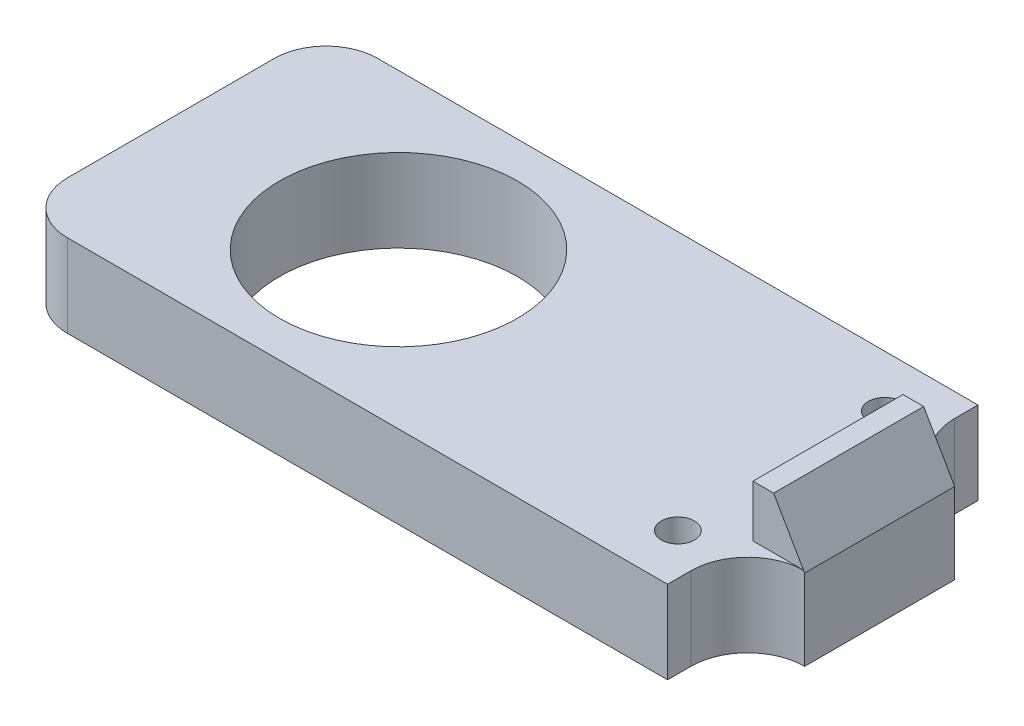
ISO-10303-21;
HEADER;
FILE_DESCRIPTION(('STEP AP214'),'2;1');
FILE_NAME('part.step','',(''),(''),'','','');
FILE_SCHEMA(('AUTOMOTIVE_DESIGN { 1 0 10303 214 1 1 1 1 }'));
ENDSEC;
DATA;
#1=APPLICATION_CONTEXT('core data for automotive mechanical design processes');
#2=APPLICATION_PROTOCOL_DEFINITION('international standard','automotive_design',2000,#1);
#3=PRODUCT_CONTEXT('',#1,'mechanical');
#4=PRODUCT('Part','Part','',(#3));
#5=PRODUCT_RELATED_PRODUCT_CATEGORY('part','',(#4));
#6=PRODUCT_DEFINITION_FORMATION('','',#4);
#7=PRODUCT_DEFINITION_CONTEXT('part definition',#1,'design');
#8=PRODUCT_DEFINITION('design','',#6,#7);
#9=PRODUCT_DEFINITION_SHAPE('','',#8);
#10=(LENGTH_UNIT() NAMED_UNIT(*) SI_UNIT(.MILLI.,.METRE.));
#11=(NAMED_UNIT(*) PLANE_ANGLE_UNIT() SI_UNIT($,.RADIAN.));
#12=(NAMED_UNIT(*) SI_UNIT($,.STERADIAN.) SOLID_ANGLE_UNIT());
#13=UNCERTAINTY_MEASURE_WITH_UNIT(LENGTH_MEASURE(1.E-05),#10,'distance_accuracy_value','');
#14=(GEOMETRIC_REPRESENTATION_CONTEXT(3) GLOBAL_UNCERTAINTY_ASSIGNED_CONTEXT((#13)) GLOBAL_UNIT_ASSIGNED_CONTEXT((#10,
#11,#12)) REPRESENTATION_CONTEXT('',''));
#15=CARTESIAN_POINT('',(0.,0.,0.));
#16=DIRECTION('',(0.,0.,1.));
#17=DIRECTION('',(1.,0.,0.));
#18=AXIS2_PLACEMENT_3D('',#15,#16,#17);
#19=CARTESIAN_POINT('',(63.,5.,0.));
#20=DIRECTION('',(-1.,0.,0.));
#21=DIRECTION('',(0.,0.,1.));
#22=AXIS2_PLACEMENT_3D('',#19,#20,#21);
#23=PLANE('',#22);
#24=DIRECTION('',(0.,0.,-1.));
#25=VECTOR('',#24,1.);
#26=CARTESIAN_POINT('',(63.,5.,0.));
#27=LINE('',#26,#25);
#28=CARTESIAN_POINT('',(63.,5.,-27.75));
#29=VERTEX_POINT('',#28);
#30=CARTESIAN_POINT('',(63.,5.,-30.));
#31=VERTEX_POINT('',#30);
#32=EDGE_CURVE('E241',#29,#31,#27,.T.);
#33=ORIENTED_EDGE('',*,*,#32,.F.);
#34=DIRECTION('',(0.,1.,0.));
#35=VECTOR('',#34,1.);
#36=CARTESIAN_POINT('',(63.,0.,-27.75));
#37=LINE('',#36,#35);
#38=CARTESIAN_POINT('',(63.,-3.,-27.75));
#39=VERTEX_POINT('',#38);
#40=EDGE_CURVE('E259',#29,#39,#37,.F.);
#41=ORIENTED_EDGE('',*,*,#40,.T.);
#42=DIRECTION('',(0.,0.,1.));
#43=VECTOR('',#42,1.);
#44=CARTESIAN_POINT('',(63.,-3.,0.));
#45=LINE('',#44,#43);
#46=CARTESIAN_POINT('',(63.,-3.,-30.));
#47=VERTEX_POINT('',#46);
#48=EDGE_CURVE('E192',#47,#39,#45,.T.);
#49=ORIENTED_EDGE('',*,*,#48,.F.);
#50=DIRECTION('',(0.,-1.,0.));
#51=VECTOR('',#50,1.);
#52=CARTESIAN_POINT('',(63.,5.,-30.));
#53=LINE('',#52,#51);
#54=EDGE_CURVE('E158',#31,#47,#53,.T.);
#55=ORIENTED_EDGE('',*,*,#54,.F.);
#56=EDGE_LOOP('',(#33,#41,#49,#55));
#57=FACE_BOUND('',#56,.T.);
#58=ADVANCED_FACE('F37',(#57),#23,.F.);
#59=CARTESIAN_POINT('',(0.,5.,0.));
#60=DIRECTION('',(0.,-1.,0.));
#61=DIRECTION('',(0.,0.,-1.));
#62=AXIS2_PLACEMENT_3D('',#59,#60,#61);
#63=PLANE('',#62);
#64=CARTESIAN_POINT('',(59.,5.,-5.));
#65=DIRECTION('',(0.,1.,0.));
#66=DIRECTION('',(0.,0.,1.));
#67=AXIS2_PLACEMENT_3D('',#64,#65,#66);
#68=CIRCLE('',#67,1.6);
#69=CARTESIAN_POINT('',(59.,5.,-3.4));
#70=VERTEX_POINT('',#69);
#71=EDGE_CURVE('E228',#70,#70,#68,.T.);
#72=ORIENTED_EDGE('',*,*,#71,.F.);
#73=EDGE_LOOP('',(#72));
#74=FACE_BOUND('',#73,.T.);
#75=CARTESIAN_POINT('',(22.,5.,-15.));
#76=DIRECTION('',(0.,1.,0.));
#77=DIRECTION('',(0.,0.,1.));
#78=AXIS2_PLACEMENT_3D('',#75,#76,#77);
#79=CIRCLE('',#78,11.5);
#80=CARTESIAN_POINT('',(22.,5.,-3.5));
#81=VERTEX_POINT('',#80);
#82=EDGE_CURVE('E232',#81,#81,#79,.T.);
#83=ORIENTED_EDGE('',*,*,#82,.F.);
#84=EDGE_LOOP('',(#83));
#85=FACE_BOUND('',#84,.T.);
#86=CARTESIAN_POINT('',(59.,5.,-25.));
#87=DIRECTION('',(0.,1.,0.));
#88=DIRECTION('',(0.,0.,1.));
#89=AXIS2_PLACEMENT_3D('',#86,#87,#88);
#90=CIRCLE('',#89,1.6);
#91=CARTESIAN_POINT('',(59.,5.,-23.4));
#92=VERTEX_POINT('',#91);
#93=EDGE_CURVE('E229',#92,#92,#90,.T.);
#94=ORIENTED_EDGE('',*,*,#93,.F.);
#95=EDGE_LOOP('',(#94));
#96=FACE_BOUND('',#95,.T.);
#97=CARTESIAN_POINT('',(68.5,5.,-2.25));
#98=DIRECTION('',(0.,-1.,0.));
#99=DIRECTION('',(0.,0.,-1.));
#100=AXIS2_PLACEMENT_3D('',#97,#98,#99);
#101=CIRCLE('',#100,5.5);
#102=CARTESIAN_POINT('',(63.,5.,-2.25));
#103=VERTEX_POINT('',#102);
#104=CARTESIAN_POINT('',(68.3867513459481,5.,-7.74883394387896));
#105=VERTEX_POINT('',#104);
#106=EDGE_CURVE('E265',#103,#105,#101,.T.);
#107=ORIENTED_EDGE('',*,*,#106,.T.);
#108=DIRECTION('',(0.,0.,1.));
#109=VECTOR('',#108,1.);
#110=CARTESIAN_POINT('',(68.3867513459481,5.,0.));
#111=LINE('',#110,#109);
#112=CARTESIAN_POINT('',(68.3867513459481,5.,-7.75));
#113=VERTEX_POINT('',#112);
#114=EDGE_CURVE('E275',#105,#113,#111,.F.);
#115=ORIENTED_EDGE('',*,*,#114,.T.);
#116=DIRECTION('',(1.,0.,0.));
#117=VECTOR('',#116,1.);
#118=CARTESIAN_POINT('',(0.,5.,-7.75));
#119=LINE('',#118,#117);
#120=CARTESIAN_POINT('',(63.5,5.,-7.75));
#121=VERTEX_POINT('',#120);
#122=EDGE_CURVE('E208',#121,#113,#119,.T.);
#123=ORIENTED_EDGE('',*,*,#122,.F.);
#124=DIRECTION('',(0.,0.,-1.));
#125=VECTOR('',#124,1.);
#126=CARTESIAN_POINT('',(63.5,5.,-7.75));
#127=LINE('',#126,#125);
#128=CARTESIAN_POINT('',(63.5,5.,-22.25));
#129=VERTEX_POINT('',#128);
#130=EDGE_CURVE('E223',#121,#129,#127,.T.);
#131=ORIENTED_EDGE('',*,*,#130,.T.);
#132=DIRECTION('',(1.,0.,0.));
#133=VECTOR('',#132,1.);
#134=CARTESIAN_POINT('',(0.,5.,-22.25));
#135=LINE('',#134,#133);
#136=CARTESIAN_POINT('',(68.3867513459481,5.,-22.25));
#137=VERTEX_POINT('',#136);
#138=EDGE_CURVE('E204',#129,#137,#135,.T.);
#139=ORIENTED_EDGE('',*,*,#138,.T.);
#140=DIRECTION('',(0.,0.,1.));
#141=VECTOR('',#140,1.);
#142=CARTESIAN_POINT('',(68.3867513459481,5.,0.));
#143=LINE('',#142,#141);
#144=CARTESIAN_POINT('',(68.3867513459481,5.,-22.251166056121));
#145=VERTEX_POINT('',#144);
#146=EDGE_CURVE('E273',#137,#145,#143,.F.);
#147=ORIENTED_EDGE('',*,*,#146,.T.);
#148=CARTESIAN_POINT('',(68.5,5.,-27.75));
#149=DIRECTION('',(0.,-1.,0.));
#150=DIRECTION('',(0.,0.,-1.));
#151=AXIS2_PLACEMENT_3D('',#148,#149,#150);
#152=CIRCLE('',#151,5.5);
#153=EDGE_CURVE('E263',#145,#29,#152,.T.);
#154=ORIENTED_EDGE('',*,*,#153,.T.);
#155=ORIENTED_EDGE('',*,*,#32,.T.);
#156=DIRECTION('',(-1.,0.,0.));
#157=VECTOR('',#156,1.);
#158=CARTESIAN_POINT('',(0.,5.,-30.));
#159=LINE('',#158,#157);
#160=CARTESIAN_POINT('',(5.,5.,-30.));
#161=VERTEX_POINT('',#160);
#162=EDGE_CURVE('E243',#31,#161,#159,.T.);
#163=ORIENTED_EDGE('',*,*,#162,.T.);
#164=CARTESIAN_POINT('',(5.,5.,-25.));
#165=DIRECTION('',(0.,-1.,0.));
#166=DIRECTION('',(0.,0.,-1.));
#167=AXIS2_PLACEMENT_3D('',#164,#165,#166);
#168=CIRCLE('',#167,5.);
#169=CARTESIAN_POINT('',(0.,5.,-25.));
#170=VERTEX_POINT('',#169);
#171=EDGE_CURVE('E253',#161,#170,#168,.F.);
#172=ORIENTED_EDGE('',*,*,#171,.T.);
#173=DIRECTION('',(0.,0.,1.));
#174=VECTOR('',#173,1.);
#175=CARTESIAN_POINT('',(0.,5.,0.));
#176=LINE('',#175,#174);
#177=CARTESIAN_POINT('',(0.,5.,-5.));
#178=VERTEX_POINT('',#177);
#179=EDGE_CURVE('E237',#170,#178,#176,.T.);
#180=ORIENTED_EDGE('',*,*,#179,.T.);
#181=CARTESIAN_POINT('',(5.,5.,-5.));
#182=DIRECTION('',(0.,-1.,0.));
#183=DIRECTION('',(0.,0.,-1.));
#184=AXIS2_PLACEMENT_3D('',#181,#182,#183);
#185=CIRCLE('',#184,5.);
#186=CARTESIAN_POINT('',(5.,5.,0.));
#187=VERTEX_POINT('',#186);
#188=EDGE_CURVE('E255',#178,#187,#185,.F.);
#189=ORIENTED_EDGE('',*,*,#188,.T.);
#190=DIRECTION('',(1.,0.,0.));
#191=VECTOR('',#190,1.);
#192=CARTESIAN_POINT('',(0.,5.,0.));
#193=LINE('',#192,#191);
#194=CARTESIAN_POINT('',(63.,5.,0.));
#195=VERTEX_POINT('',#194);
#196=EDGE_CURVE('E239',#187,#195,#193,.T.);
#197=ORIENTED_EDGE('',*,*,#196,.T.);
#198=EDGE_CURVE('E154',#195,#103,#27,.T.);
#199=ORIENTED_EDGE('',*,*,#198,.T.);
#200=EDGE_LOOP('',(#107,#115,#123,#131,#139,#147,#154,#155,#163,#172,#180,#189,#197,#199));
#201=FACE_BOUND('',#200,.T.);
#202=ADVANCED_FACE('F285',(#74,#85,#96,#201),#63,.F.);
#203=CARTESIAN_POINT('',(0.,5.,0.));
#204=DIRECTION('',(1.,0.,0.));
#205=DIRECTION('',(0.,0.,-1.));
#206=AXIS2_PLACEMENT_3D('',#203,#204,#205);
#207=PLANE('',#206);
#208=DIRECTION('',(0.,-1.,0.));
#209=VECTOR('',#208,1.);
#210=CARTESIAN_POINT('',(0.,5.,-25.));
#211=LINE('',#210,#209);
#212=CARTESIAN_POINT('',(0.,-3.,-25.));
#213=VERTEX_POINT('',#212);
#214=EDGE_CURVE('E248',#170,#213,#211,.T.);
#215=ORIENTED_EDGE('',*,*,#214,.T.);
#216=DIRECTION('',(0.,0.,-1.));
#217=VECTOR('',#216,1.);
#218=CARTESIAN_POINT('',(0.,-3.,0.));
#219=LINE('',#218,#217);
#220=CARTESIAN_POINT('',(0.,-3.,-5.));
#221=VERTEX_POINT('',#220);
#222=EDGE_CURVE('E183',#221,#213,#219,.T.);
#223=ORIENTED_EDGE('',*,*,#222,.F.);
#224=DIRECTION('',(0.,-1.,0.));
#225=VECTOR('',#224,1.);
#226=CARTESIAN_POINT('',(0.,5.,-5.));
#227=LINE('',#226,#225);
#228=EDGE_CURVE('E250',#221,#178,#227,.F.);
#229=ORIENTED_EDGE('',*,*,#228,.T.);
#230=ORIENTED_EDGE('',*,*,#179,.F.);
#231=EDGE_LOOP('',(#215,#223,#229,#230));
#232=FACE_BOUND('',#231,.T.);
#233=ADVANCED_FACE('F308',(#232),#207,.F.);
#234=CARTESIAN_POINT('',(0.,5.,0.));
#235=DIRECTION('',(0.,0.,-1.));
#236=DIRECTION('',(-1.,0.,0.));
#237=AXIS2_PLACEMENT_3D('',#234,#235,#236);
#238=PLANE('',#237);
#239=ORIENTED_EDGE('',*,*,#196,.F.);
#240=DIRECTION('',(0.,-1.,0.));
#241=VECTOR('',#240,1.);
#242=CARTESIAN_POINT('',(5.,5.,0.));
#243=LINE('',#242,#241);
#244=CARTESIAN_POINT('',(5.,-3.,0.));
#245=VERTEX_POINT('',#244);
#246=EDGE_CURVE('E157',#187,#245,#243,.T.);
#247=ORIENTED_EDGE('',*,*,#246,.T.);
#248=DIRECTION('',(-1.,0.,0.));
#249=VECTOR('',#248,1.);
#250=CARTESIAN_POINT('',(0.,-3.,0.));
#251=LINE('',#250,#249);
#252=CARTESIAN_POINT('',(63.,-3.,0.));
#253=VERTEX_POINT('',#252);
#254=EDGE_CURVE('E161',#253,#245,#251,.T.);
#255=ORIENTED_EDGE('',*,*,#254,.F.);
#256=DIRECTION('',(0.,-1.,0.));
#257=VECTOR('',#256,1.);
#258=CARTESIAN_POINT('',(63.,5.,0.));
#259=LINE('',#258,#257);
#260=EDGE_CURVE('E147',#195,#253,#259,.T.);
#261=ORIENTED_EDGE('',*,*,#260,.F.);
#262=EDGE_LOOP('',(#239,#247,#255,#261));
#263=FACE_BOUND('',#262,.T.);
#264=ADVANCED_FACE('F162',(#263),#238,.F.);
#265=ORIENTED_EDGE('',*,*,#260,.T.);
#266=DIRECTION('',(0.,0.,1.));
#267=VECTOR('',#266,1.);
#268=CARTESIAN_POINT('',(63.,-3.,0.));
#269=LINE('',#268,#267);
#270=CARTESIAN_POINT('',(63.,-3.,-2.25));
#271=VERTEX_POINT('',#270);
#272=EDGE_CURVE('E152',#271,#253,#269,.T.);
#273=ORIENTED_EDGE('',*,*,#272,.F.);
#274=DIRECTION('',(0.,1.,0.));
#275=VECTOR('',#274,1.);
#276=CARTESIAN_POINT('',(63.,5.,-2.25));
#277=LINE('',#276,#275);
#278=EDGE_CURVE('E261',#271,#103,#277,.T.);
#279=ORIENTED_EDGE('',*,*,#278,.T.);
#280=ORIENTED_EDGE('',*,*,#198,.F.);
#281=EDGE_LOOP('',(#265,#273,#279,#280));
#282=FACE_BOUND('',#281,.T.);
#283=ADVANCED_FACE('F149',(#282),#23,.F.);
#284=CARTESIAN_POINT('',(0.,5.,-30.));
#285=DIRECTION('',(0.,0.,1.));
#286=DIRECTION('',(1.,0.,0.));
#287=AXIS2_PLACEMENT_3D('',#284,#285,#286);
#288=PLANE('',#287);
#289=ORIENTED_EDGE('',*,*,#54,.T.);
#290=DIRECTION('',(1.,0.,0.));
#291=VECTOR('',#290,1.);
#292=CARTESIAN_POINT('',(0.,-3.,-30.));
#293=LINE('',#292,#291);
#294=CARTESIAN_POINT('',(5.,-3.,-30.));
#295=VERTEX_POINT('',#294);
#296=EDGE_CURVE('E189',#295,#47,#293,.T.);
#297=ORIENTED_EDGE('',*,*,#296,.F.);
#298=DIRECTION('',(0.,-1.,0.));
#299=VECTOR('',#298,1.);
#300=CARTESIAN_POINT('',(5.,5.,-30.));
#301=LINE('',#300,#299);
#302=EDGE_CURVE('E257',#295,#161,#301,.F.);
#303=ORIENTED_EDGE('',*,*,#302,.T.);
#304=ORIENTED_EDGE('',*,*,#162,.F.);
#305=EDGE_LOOP('',(#289,#297,#303,#304));
#306=FACE_BOUND('',#305,.T.);
#307=ADVANCED_FACE('F317',(#306),#288,.F.);
#308=CARTESIAN_POINT('',(22.,5.,-15.));
#309=DIRECTION('',(0.,-1.,0.));
#310=DIRECTION('',(0.,0.,-1.));
#311=AXIS2_PLACEMENT_3D('',#308,#309,#310);
#312=CYLINDRICAL_SURFACE('',#311,11.5);
#313=ORIENTED_EDGE('',*,*,#82,.T.);
#314=EDGE_LOOP('',(#313));
#315=FACE_BOUND('',#314,.T.);
#316=CARTESIAN_POINT('',(22.,-3.,-15.));
#317=DIRECTION('',(0.,-1.,0.));
#318=DIRECTION('',(0.,0.,-1.));
#319=AXIS2_PLACEMENT_3D('',#316,#317,#318);
#320=CIRCLE('',#319,11.5);
#321=CARTESIAN_POINT('',(22.,-3.,-26.5));
#322=VERTEX_POINT('',#321);
#323=EDGE_CURVE('E175',#322,#322,#320,.F.);
#324=ORIENTED_EDGE('',*,*,#323,.F.);
#325=EDGE_LOOP('',(#324));
#326=FACE_BOUND('',#325,.T.);
#327=ADVANCED_FACE('F336',(#315,#326),#312,.F.);
#328=CARTESIAN_POINT('',(59.,0.,-5.));
#329=DIRECTION('',(0.,1.,0.));
#330=DIRECTION('',(0.,0.,1.));
#331=AXIS2_PLACEMENT_3D('',#328,#329,#330);
#332=CYLINDRICAL_SURFACE('',#331,1.6);
#333=ORIENTED_EDGE('',*,*,#71,.T.);
#334=EDGE_LOOP('',(#333));
#335=FACE_BOUND('',#334,.T.);
#336=CARTESIAN_POINT('',(59.,-3.,-5.));
#337=DIRECTION('',(0.,-1.,0.));
#338=DIRECTION('',(0.,0.,-1.));
#339=AXIS2_PLACEMENT_3D('',#336,#337,#338);
#340=CIRCLE('',#339,1.6);
#341=CARTESIAN_POINT('',(59.,-3.,-6.6));
#342=VERTEX_POINT('',#341);
#343=EDGE_CURVE('E178',#342,#342,#340,.F.);
#344=ORIENTED_EDGE('',*,*,#343,.F.);
#345=EDGE_LOOP('',(#344));
#346=FACE_BOUND('',#345,.T.);
#347=ADVANCED_FACE('F371',(#335,#346),#332,.F.);
#348=CARTESIAN_POINT('',(59.,0.,-25.));
#349=DIRECTION('',(0.,1.,0.));
#350=DIRECTION('',(0.,0.,1.));
#351=AXIS2_PLACEMENT_3D('',#348,#349,#350);
#352=CYLINDRICAL_SURFACE('',#351,1.6);
#353=ORIENTED_EDGE('',*,*,#93,.T.);
#354=EDGE_LOOP('',(#353));
#355=FACE_BOUND('',#354,.T.);
#356=CARTESIAN_POINT('',(59.,-3.,-25.));
#357=DIRECTION('',(0.,-1.,0.));
#358=DIRECTION('',(0.,0.,-1.));
#359=AXIS2_PLACEMENT_3D('',#356,#357,#358);
#360=CIRCLE('',#359,1.6);
#361=CARTESIAN_POINT('',(59.,-3.,-26.6));
#362=VERTEX_POINT('',#361);
#363=EDGE_CURVE('E201',#362,#362,#360,.F.);
#364=ORIENTED_EDGE('',*,*,#363,.F.);
#365=EDGE_LOOP('',(#364));
#366=FACE_BOUND('',#365,.T.);
#367=ADVANCED_FACE('F344',(#355,#366),#352,.F.);
#368=CARTESIAN_POINT('',(5.,5.,-5.));
#369=DIRECTION('',(0.,-1.,0.));
#370=DIRECTION('',(0.,0.,-1.));
#371=AXIS2_PLACEMENT_3D('',#368,#369,#370);
#372=CYLINDRICAL_SURFACE('',#371,5.);
#373=ORIENTED_EDGE('',*,*,#188,.F.);
#374=ORIENTED_EDGE('',*,*,#228,.F.);
#375=CARTESIAN_POINT('',(5.,-3.,-5.));
#376=DIRECTION('',(0.,-1.,0.));
#377=DIRECTION('',(0.,0.,-1.));
#378=AXIS2_PLACEMENT_3D('',#375,#376,#377);
#379=CIRCLE('',#378,5.);
#380=EDGE_CURVE('E167',#245,#221,#379,.T.);
#381=ORIENTED_EDGE('',*,*,#380,.F.);
#382=ORIENTED_EDGE('',*,*,#246,.F.);
#383=EDGE_LOOP('',(#373,#374,#381,#382));
#384=FACE_BOUND('',#383,.T.);
#385=ADVANCED_FACE('F304',(#384),#372,.T.);
#386=CARTESIAN_POINT('',(5.,5.,-25.));
#387=DIRECTION('',(0.,-1.,0.));
#388=DIRECTION('',(0.,0.,-1.));
#389=AXIS2_PLACEMENT_3D('',#386,#387,#388);
#390=CYLINDRICAL_SURFACE('',#389,5.);
#391=ORIENTED_EDGE('',*,*,#171,.F.);
#392=ORIENTED_EDGE('',*,*,#302,.F.);
#393=CARTESIAN_POINT('',(5.,-3.,-25.));
#394=DIRECTION('',(0.,-1.,0.));
#395=DIRECTION('',(0.,0.,-1.));
#396=AXIS2_PLACEMENT_3D('',#393,#394,#395);
#397=CIRCLE('',#396,5.);
#398=EDGE_CURVE('E186',#213,#295,#397,.T.);
#399=ORIENTED_EDGE('',*,*,#398,.F.);
#400=ORIENTED_EDGE('',*,*,#214,.F.);
#401=EDGE_LOOP('',(#391,#392,#399,#400));
#402=FACE_BOUND('',#401,.T.);
#403=ADVANCED_FACE('F313',(#402),#390,.T.);
#404=CARTESIAN_POINT('',(63.5,0.,0.));
#405=DIRECTION('',(-1.,0.,0.));
#406=DIRECTION('',(0.,0.,1.));
#407=AXIS2_PLACEMENT_3D('',#404,#405,#406);
#408=PLANE('',#407);
#409=DIRECTION('',(0.,-1.,0.));
#410=VECTOR('',#409,1.);
#411=CARTESIAN_POINT('',(63.5,0.,-7.75));
#412=LINE('',#411,#410);
#413=CARTESIAN_POINT('',(63.5,10.,-7.75));
#414=VERTEX_POINT('',#413);
#415=EDGE_CURVE('E207',#414,#121,#412,.T.);
#416=ORIENTED_EDGE('',*,*,#415,.F.);
#417=DIRECTION('',(0.,0.,1.));
#418=VECTOR('',#417,1.);
#419=CARTESIAN_POINT('',(63.5,10.,-7.75));
#420=LINE('',#419,#418);
#421=CARTESIAN_POINT('',(63.5,10.,-22.25));
#422=VERTEX_POINT('',#421);
#423=EDGE_CURVE('E217',#422,#414,#420,.T.);
#424=ORIENTED_EDGE('',*,*,#423,.F.);
#425=DIRECTION('',(0.,1.,0.));
#426=VECTOR('',#425,1.);
#427=CARTESIAN_POINT('',(63.5,0.,-22.25));
#428=LINE('',#427,#426);
#429=EDGE_CURVE('E215',#129,#422,#428,.T.);
#430=ORIENTED_EDGE('',*,*,#429,.F.);
#431=ORIENTED_EDGE('',*,*,#130,.F.);
#432=EDGE_LOOP('',(#416,#424,#430,#431));
#433=FACE_BOUND('',#432,.T.);
#434=ADVANCED_FACE('F347',(#433),#408,.T.);
#435=CARTESIAN_POINT('',(68.5,10.,-7.75));
#436=DIRECTION('',(0.,-1.,0.));
#437=DIRECTION('',(0.,0.,-1.));
#438=AXIS2_PLACEMENT_3D('',#435,#436,#437);
#439=PLANE('',#438);
#440=DIRECTION('',(1.,0.,0.));
#441=VECTOR('',#440,1.);
#442=CARTESIAN_POINT('',(0.,10.,-7.75));
#443=LINE('',#442,#441);
#444=CARTESIAN_POINT('',(65.5,10.,-7.75));
#445=VERTEX_POINT('',#444);
#446=EDGE_CURVE('E205',#414,#445,#443,.T.);
#447=ORIENTED_EDGE('',*,*,#446,.T.);
#448=DIRECTION('',(0.,0.,-1.));
#449=VECTOR('',#448,1.);
#450=CARTESIAN_POINT('',(65.5,10.,-7.75));
#451=LINE('',#450,#449);
#452=CARTESIAN_POINT('',(65.5,10.,-22.25));
#453=VERTEX_POINT('',#452);
#454=EDGE_CURVE('E53',#445,#453,#451,.T.);
#455=ORIENTED_EDGE('',*,*,#454,.T.);
#456=DIRECTION('',(1.,0.,0.));
#457=VECTOR('',#456,1.);
#458=CARTESIAN_POINT('',(0.,10.,-22.25));
#459=LINE('',#458,#457);
#460=EDGE_CURVE('E210',#422,#453,#459,.T.);
#461=ORIENTED_EDGE('',*,*,#460,.F.);
#462=ORIENTED_EDGE('',*,*,#423,.T.);
#463=EDGE_LOOP('',(#447,#455,#461,#462));
#464=FACE_BOUND('',#463,.T.);
#465=ADVANCED_FACE('F363',(#464),#439,.F.);
#466=CARTESIAN_POINT('',(68.5,0.,0.));
#467=DIRECTION('',(-1.,0.,0.));
#468=DIRECTION('',(0.,0.,1.));
#469=AXIS2_PLACEMENT_3D('',#466,#467,#468);
#470=PLANE('',#469);
#471=DIRECTION('',(0.,1.,0.));
#472=VECTOR('',#471,1.);
#473=CARTESIAN_POINT('',(68.5,0.,-22.25));
#474=LINE('',#473,#472);
#475=CARTESIAN_POINT('',(68.5,-3.,-22.25));
#476=VERTEX_POINT('',#475);
#477=CARTESIAN_POINT('',(68.5,4.80384757729338,-22.25));
#478=VERTEX_POINT('',#477);
#479=EDGE_CURVE('E220',#476,#478,#474,.T.);
#480=ORIENTED_EDGE('',*,*,#479,.T.);
#481=DIRECTION('',(0.,0.,1.));
#482=VECTOR('',#481,1.);
#483=CARTESIAN_POINT('',(68.5,4.80384757729338,0.));
#484=LINE('',#483,#482);
#485=CARTESIAN_POINT('',(68.5,4.80384757729338,-7.75));
#486=VERTEX_POINT('',#485);
#487=EDGE_CURVE('E268',#478,#486,#484,.T.);
#488=ORIENTED_EDGE('',*,*,#487,.T.);
#489=DIRECTION('',(0.,-1.,0.));
#490=VECTOR('',#489,1.);
#491=CARTESIAN_POINT('',(68.5,0.,-7.75));
#492=LINE('',#491,#490);
#493=CARTESIAN_POINT('',(68.5,-3.,-7.75));
#494=VERTEX_POINT('',#493);
#495=EDGE_CURVE('E218',#486,#494,#492,.T.);
#496=ORIENTED_EDGE('',*,*,#495,.T.);
#497=DIRECTION('',(0.,0.,1.));
#498=VECTOR('',#497,1.);
#499=CARTESIAN_POINT('',(68.5,-3.,0.));
#500=LINE('',#499,#498);
#501=EDGE_CURVE('E198',#476,#494,#500,.T.);
#502=ORIENTED_EDGE('',*,*,#501,.F.);
#503=EDGE_LOOP('',(#480,#488,#496,#502));
#504=FACE_BOUND('',#503,.T.);
#505=ADVANCED_FACE('F297',(#504),#470,.F.);
#506=CARTESIAN_POINT('',(68.5,0.,-27.75));
#507=DIRECTION('',(0.,-1.,0.));
#508=DIRECTION('',(0.,0.,-1.));
#509=AXIS2_PLACEMENT_3D('',#506,#507,#508);
#510=CYLINDRICAL_SURFACE('',#509,5.5);
#511=ORIENTED_EDGE('',*,*,#153,.F.);
#512=CARTESIAN_POINT('',(68.5,4.80384757729338,-27.75));
#513=DIRECTION('',(-0.866025403784438,-0.500000000000002,0.));
#514=DIRECTION('',(0.500000000000002,-0.866025403784438,0.));
#515=AXIS2_PLACEMENT_3D('',#512,#513,#514);
#516=ELLIPSE('',#515,11.,5.5);
#517=EDGE_CURVE('E11',#145,#478,#516,.F.);
#518=ORIENTED_EDGE('',*,*,#517,.T.);
#519=ORIENTED_EDGE('',*,*,#479,.F.);
#520=CARTESIAN_POINT('',(68.5,-3.,-27.75));
#521=DIRECTION('',(0.,-1.,0.));
#522=DIRECTION('',(0.,0.,-1.));
#523=AXIS2_PLACEMENT_3D('',#520,#521,#522);
#524=CIRCLE('',#523,5.5);
#525=EDGE_CURVE('E195',#39,#476,#524,.F.);
#526=ORIENTED_EDGE('',*,*,#525,.F.);
#527=ORIENTED_EDGE('',*,*,#40,.F.);
#528=EDGE_LOOP('',(#511,#518,#519,#526,#527));
#529=FACE_BOUND('',#528,.T.);
#530=ADVANCED_FACE('F292',(#529),#510,.F.);
#531=CARTESIAN_POINT('',(68.5,5.,-2.25));
#532=DIRECTION('',(0.,1.,0.));
#533=DIRECTION('',(0.,0.,1.));
#534=AXIS2_PLACEMENT_3D('',#531,#532,#533);
#535=CYLINDRICAL_SURFACE('',#534,5.5);
#536=ORIENTED_EDGE('',*,*,#495,.F.);
#537=CARTESIAN_POINT('',(68.5,4.80384757729338,-2.25));
#538=DIRECTION('',(-0.866025403784438,-0.500000000000002,0.));
#539=DIRECTION('',(-0.500000000000002,0.866025403784438,0.));
#540=AXIS2_PLACEMENT_3D('',#537,#538,#539);
#541=ELLIPSE('',#540,11.,5.5);
#542=EDGE_CURVE('E271',#486,#105,#541,.F.);
#543=ORIENTED_EDGE('',*,*,#542,.T.);
#544=ORIENTED_EDGE('',*,*,#106,.F.);
#545=ORIENTED_EDGE('',*,*,#278,.F.);
#546=CARTESIAN_POINT('',(68.5,-3.,-2.25));
#547=DIRECTION('',(0.,-1.,0.));
#548=DIRECTION('',(0.,0.,-1.));
#549=AXIS2_PLACEMENT_3D('',#546,#547,#548);
#550=CIRCLE('',#549,5.5);
#551=EDGE_CURVE('E174',#494,#271,#550,.F.);
#552=ORIENTED_EDGE('',*,*,#551,.F.);
#553=EDGE_LOOP('',(#536,#543,#544,#545,#552));
#554=FACE_BOUND('',#553,.T.);
#555=ADVANCED_FACE('F300',(#554),#535,.F.);
#556=CARTESIAN_POINT('',(0.,5.,-7.75));
#557=DIRECTION('',(0.,0.,-1.));
#558=DIRECTION('',(-1.,0.,0.));
#559=AXIS2_PLACEMENT_3D('',#556,#557,#558);
#560=PLANE('',#559);
#561=ORIENTED_EDGE('',*,*,#122,.T.);
#562=DIRECTION('',(0.500000000000002,-0.866025403784438,0.));
#563=VECTOR('',#562,1.);
#564=CARTESIAN_POINT('',(68.5,4.80384757729338,-7.75));
#565=LINE('',#564,#563);
#566=EDGE_CURVE('E61',#113,#445,#565,.F.);
#567=ORIENTED_EDGE('',*,*,#566,.T.);
#568=ORIENTED_EDGE('',*,*,#446,.F.);
#569=ORIENTED_EDGE('',*,*,#415,.T.);
#570=EDGE_LOOP('',(#561,#567,#568,#569));
#571=FACE_BOUND('',#570,.T.);
#572=ADVANCED_FACE('F350',(#571),#560,.F.);
#573=CARTESIAN_POINT('',(0.,10.,-22.25));
#574=DIRECTION('',(0.,0.,1.));
#575=DIRECTION('',(1.,0.,0.));
#576=AXIS2_PLACEMENT_3D('',#573,#574,#575);
#577=PLANE('',#576);
#578=ORIENTED_EDGE('',*,*,#460,.T.);
#579=DIRECTION('',(-0.500000000000002,0.866025403784438,0.));
#580=VECTOR('',#579,1.);
#581=CARTESIAN_POINT('',(68.5,4.80384757729338,-22.25));
#582=LINE('',#581,#580);
#583=EDGE_CURVE('E46',#453,#137,#582,.F.);
#584=ORIENTED_EDGE('',*,*,#583,.T.);
#585=ORIENTED_EDGE('',*,*,#138,.F.);
#586=ORIENTED_EDGE('',*,*,#429,.T.);
#587=EDGE_LOOP('',(#578,#584,#585,#586));
#588=FACE_BOUND('',#587,.T.);
#589=ADVANCED_FACE('F280',(#588),#577,.F.);
#590=CARTESIAN_POINT('',(68.5,4.80384757729338,0.));
#591=DIRECTION('',(-0.866025403784438,-0.500000000000002,0.));
#592=DIRECTION('',(0.,0.,1.));
#593=AXIS2_PLACEMENT_3D('',#590,#591,#592);
#594=PLANE('',#593);
#595=ORIENTED_EDGE('',*,*,#583,.F.);
#596=ORIENTED_EDGE('',*,*,#454,.F.);
#597=ORIENTED_EDGE('',*,*,#566,.F.);
#598=ORIENTED_EDGE('',*,*,#114,.F.);
#599=ORIENTED_EDGE('',*,*,#542,.F.);
#600=ORIENTED_EDGE('',*,*,#487,.F.);
#601=ORIENTED_EDGE('',*,*,#517,.F.);
#602=ORIENTED_EDGE('',*,*,#146,.F.);
#603=EDGE_LOOP('',(#595,#596,#597,#598,#599,#600,#601,#602));
#604=FACE_BOUND('',#603,.T.);
#605=ADVANCED_FACE('F40',(#604),#594,.F.);
#606=CARTESIAN_POINT('',(0.,-3.,0.));
#607=DIRECTION('',(0.,-1.,0.));
#608=DIRECTION('',(0.,0.,-1.));
#609=AXIS2_PLACEMENT_3D('',#606,#607,#608);
#610=PLANE('',#609);
#611=ORIENTED_EDGE('',*,*,#343,.T.);
#612=EDGE_LOOP('',(#611));
#613=FACE_BOUND('',#612,.T.);
#614=ORIENTED_EDGE('',*,*,#323,.T.);
#615=EDGE_LOOP('',(#614));
#616=FACE_BOUND('',#615,.T.);
#617=ORIENTED_EDGE('',*,*,#272,.T.);
#618=ORIENTED_EDGE('',*,*,#254,.T.);
#619=ORIENTED_EDGE('',*,*,#380,.T.);
#620=ORIENTED_EDGE('',*,*,#222,.T.);
#621=ORIENTED_EDGE('',*,*,#398,.T.);
#622=ORIENTED_EDGE('',*,*,#296,.T.);
#623=ORIENTED_EDGE('',*,*,#48,.T.);
#624=ORIENTED_EDGE('',*,*,#525,.T.);
#625=ORIENTED_EDGE('',*,*,#501,.T.);
#626=ORIENTED_EDGE('',*,*,#551,.T.);
#627=EDGE_LOOP('',(#617,#618,#619,#620,#621,#622,#623,#624,#625,#626));
#628=FACE_BOUND('',#627,.T.);
#629=ORIENTED_EDGE('',*,*,#363,.T.);
#630=EDGE_LOOP('',(#629));
#631=FACE_BOUND('',#630,.T.);
#632=ADVANCED_FACE('F170',(#613,#616,#628,#631),#610,.T.);
#633=CLOSED_SHELL('',(#58,#202,#233,#264,#283,#307,#327,#347,#367,#385,#403,#434,#465,#505,#530,
#555,#572,#589,#605,#632));
#634=MANIFOLD_SOLID_BREP('B2',#633);
#635=ADVANCED_BREP_SHAPE_REPRESENTATION('',(#18,#634),#14);
#636=SHAPE_DEFINITION_REPRESENTATION(#9,#635);
ENDSEC;
END-ISO-10303-21;
